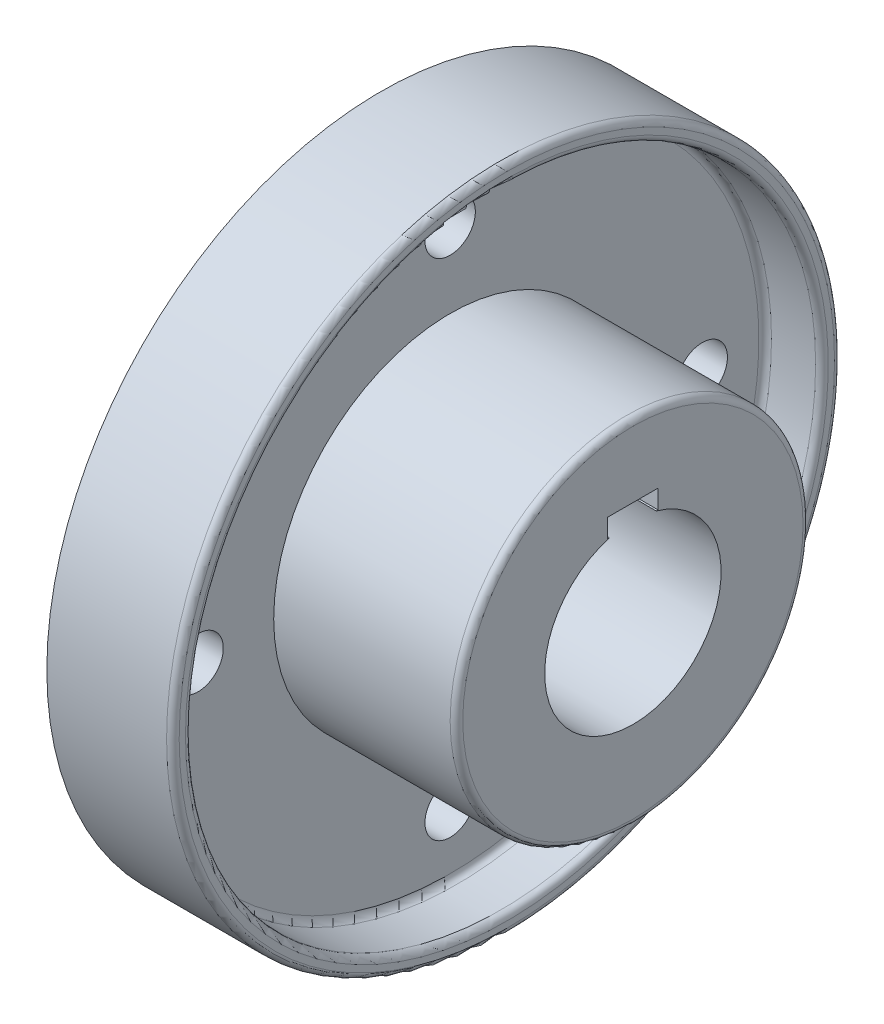
ISO-10303-21;
HEADER;
FILE_DESCRIPTION(('STEP AP214'),'2;1');
FILE_NAME('part.step','',(''),(''),'','','');
FILE_SCHEMA(('AUTOMOTIVE_DESIGN { 1 0 10303 214 1 1 1 1 }'));
ENDSEC;
DATA;
#1=APPLICATION_CONTEXT('core data for automotive mechanical design processes');
#2=APPLICATION_PROTOCOL_DEFINITION('international standard','automotive_design',2000,#1);
#3=PRODUCT_CONTEXT('',#1,'mechanical');
#4=PRODUCT('Part','Part','',(#3));
#5=PRODUCT_RELATED_PRODUCT_CATEGORY('part','',(#4));
#6=PRODUCT_DEFINITION_FORMATION('','',#4);
#7=PRODUCT_DEFINITION_CONTEXT('part definition',#1,'design');
#8=PRODUCT_DEFINITION('design','',#6,#7);
#9=PRODUCT_DEFINITION_SHAPE('','',#8);
#10=(LENGTH_UNIT() NAMED_UNIT(*) SI_UNIT(.MILLI.,.METRE.));
#11=(NAMED_UNIT(*) PLANE_ANGLE_UNIT() SI_UNIT($,.RADIAN.));
#12=(NAMED_UNIT(*) SI_UNIT($,.STERADIAN.) SOLID_ANGLE_UNIT());
#13=UNCERTAINTY_MEASURE_WITH_UNIT(LENGTH_MEASURE(1.E-05),#10,'distance_accuracy_value','');
#14=(GEOMETRIC_REPRESENTATION_CONTEXT(3) GLOBAL_UNCERTAINTY_ASSIGNED_CONTEXT((#13)) GLOBAL_UNIT_ASSIGNED_CONTEXT((#10,
#11,#12)) REPRESENTATION_CONTEXT('',''));
#15=CARTESIAN_POINT('',(0.,0.,0.));
#16=DIRECTION('',(0.,0.,1.));
#17=DIRECTION('',(1.,0.,0.));
#18=AXIS2_PLACEMENT_3D('',#15,#16,#17);
#19=CARTESIAN_POINT('',(0.,106.,0.));
#20=DIRECTION('',(1.,0.,0.));
#21=DIRECTION('',(0.,0.,-1.));
#22=AXIS2_PLACEMENT_3D('',#19,#20,#21);
#23=PLANE('',#22);
#24=CARTESIAN_POINT('',(0.,8.34771439644569E-13,80.));
#25=DIRECTION('',(-1.,0.,0.));
#26=DIRECTION('',(0.,-1.,0.));
#27=AXIS2_PLACEMENT_3D('',#24,#25,#26);
#28=CIRCLE('',#27,8.);
#29=CARTESIAN_POINT('',(0.,-7.99999999999917,80.0000000000001));
#30=VERTEX_POINT('',#29);
#31=EDGE_CURVE('E123',#30,#30,#28,.T.);
#32=ORIENTED_EDGE('',*,*,#31,.F.);
#33=EDGE_LOOP('',(#32));
#34=FACE_BOUND('',#33,.T.);
#35=CARTESIAN_POINT('',(0.,-80.,0.));
#36=DIRECTION('',(-1.,0.,0.));
#37=DIRECTION('',(0.,0.,-1.));
#38=AXIS2_PLACEMENT_3D('',#35,#36,#37);
#39=CIRCLE('',#38,8.);
#40=CARTESIAN_POINT('',(0.,-80.,-8.00000000000001));
#41=VERTEX_POINT('',#40);
#42=EDGE_CURVE('E130',#41,#41,#39,.T.);
#43=ORIENTED_EDGE('',*,*,#42,.F.);
#44=EDGE_LOOP('',(#43));
#45=FACE_BOUND('',#44,.T.);
#46=CARTESIAN_POINT('',(0.,-2.76134425429668E-13,-80.));
#47=DIRECTION('',(-1.,0.,0.));
#48=DIRECTION('',(0.,1.,0.));
#49=AXIS2_PLACEMENT_3D('',#46,#47,#48);
#50=CIRCLE('',#49,8.);
#51=CARTESIAN_POINT('',(0.,7.99999999999973,-80.));
#52=VERTEX_POINT('',#51);
#53=EDGE_CURVE('E134',#52,#52,#50,.T.);
#54=ORIENTED_EDGE('',*,*,#53,.F.);
#55=EDGE_LOOP('',(#54));
#56=FACE_BOUND('',#55,.T.);
#57=CARTESIAN_POINT('',(0.,80.,0.));
#58=DIRECTION('',(-1.,0.,0.));
#59=DIRECTION('',(0.,0.,1.));
#60=AXIS2_PLACEMENT_3D('',#57,#58,#59);
#61=CIRCLE('',#60,8.);
#62=CARTESIAN_POINT('',(0.,80.,8.00000000000001));
#63=VERTEX_POINT('',#62);
#64=EDGE_CURVE('E138',#63,#63,#61,.T.);
#65=ORIENTED_EDGE('',*,*,#64,.F.);
#66=EDGE_LOOP('',(#65));
#67=FACE_BOUND('',#66,.T.);
#68=CARTESIAN_POINT('',(0.,0.,0.));
#69=DIRECTION('',(1.,0.,0.));
#70=DIRECTION('',(0.,0.,-1.));
#71=AXIS2_PLACEMENT_3D('',#68,#69,#70);
#72=CIRCLE('',#71,46.);
#73=CARTESIAN_POINT('',(0.,0.,-46.));
#74=VERTEX_POINT('',#73);
#75=EDGE_CURVE('E181',#74,#74,#72,.F.);
#76=ORIENTED_EDGE('',*,*,#75,.F.);
#77=EDGE_LOOP('',(#76));
#78=FACE_BOUND('',#77,.T.);
#79=CARTESIAN_POINT('',(0.,0.,0.));
#80=DIRECTION('',(-1.,0.,0.));
#81=DIRECTION('',(0.,0.,1.));
#82=AXIS2_PLACEMENT_3D('',#79,#80,#81);
#83=CIRCLE('',#82,106.);
#84=CARTESIAN_POINT('',(0.,0.,106.));
#85=VERTEX_POINT('',#84);
#86=EDGE_CURVE('E151',#85,#85,#83,.T.);
#87=ORIENTED_EDGE('',*,*,#86,.T.);
#88=EDGE_LOOP('',(#87));
#89=FACE_BOUND('',#88,.T.);
#90=ADVANCED_FACE('F32',(#34,#45,#56,#67,#78,#89),#23,.F.);
#91=CARTESIAN_POINT('',(80.,0.,0.));
#92=DIRECTION('',(-1.,0.,0.));
#93=DIRECTION('',(0.,0.,1.));
#94=AXIS2_PLACEMENT_3D('',#91,#92,#93);
#95=PLANE('',#94);
#96=CARTESIAN_POINT('',(80.,0.,0.));
#97=DIRECTION('',(1.,0.,0.));
#98=DIRECTION('',(0.,0.,-1.));
#99=AXIS2_PLACEMENT_3D('',#96,#97,#98);
#100=CIRCLE('',#99,28.);
#101=CARTESIAN_POINT('',(80.,27.,7.41619848709567));
#102=VERTEX_POINT('',#101);
#103=CARTESIAN_POINT('',(80.,27.,-7.41619848709567));
#104=VERTEX_POINT('',#103);
#105=EDGE_CURVE('E146',#102,#104,#100,.T.);
#106=ORIENTED_EDGE('',*,*,#105,.F.);
#107=DIRECTION('',(0.,0.,1.));
#108=VECTOR('',#107,1.);
#109=CARTESIAN_POINT('',(80.,27.,-8.));
#110=LINE('',#109,#108);
#111=CARTESIAN_POINT('',(80.,27.,8.));
#112=VERTEX_POINT('',#111);
#113=EDGE_CURVE('E46',#102,#112,#110,.T.);
#114=ORIENTED_EDGE('',*,*,#113,.T.);
#115=DIRECTION('',(0.,1.,0.));
#116=VECTOR('',#115,1.);
#117=CARTESIAN_POINT('',(80.,27.,8.));
#118=LINE('',#117,#116);
#119=CARTESIAN_POINT('',(80.,33.,8.));
#120=VERTEX_POINT('',#119);
#121=EDGE_CURVE('E88',#112,#120,#118,.T.);
#122=ORIENTED_EDGE('',*,*,#121,.T.);
#123=DIRECTION('',(0.,0.,-1.));
#124=VECTOR('',#123,1.);
#125=CARTESIAN_POINT('',(80.,33.,-8.));
#126=LINE('',#125,#124);
#127=CARTESIAN_POINT('',(80.,33.,-8.));
#128=VERTEX_POINT('',#127);
#129=EDGE_CURVE('E98',#120,#128,#126,.T.);
#130=ORIENTED_EDGE('',*,*,#129,.T.);
#131=DIRECTION('',(0.,-1.,0.));
#132=VECTOR('',#131,1.);
#133=CARTESIAN_POINT('',(80.,27.,-8.));
#134=LINE('',#133,#132);
#135=CARTESIAN_POINT('',(80.,27.,-8.));
#136=VERTEX_POINT('',#135);
#137=EDGE_CURVE('E103',#128,#136,#134,.T.);
#138=ORIENTED_EDGE('',*,*,#137,.T.);
#139=EDGE_CURVE('E95',#136,#104,#110,.T.);
#140=ORIENTED_EDGE('',*,*,#139,.T.);
#141=EDGE_LOOP('',(#106,#114,#122,#130,#138,#140));
#142=FACE_BOUND('',#141,.T.);
#143=CARTESIAN_POINT('',(80.,0.,0.));
#144=DIRECTION('',(-1.,0.,0.));
#145=DIRECTION('',(0.,0.,1.));
#146=AXIS2_PLACEMENT_3D('',#143,#144,#145);
#147=CIRCLE('',#146,54.);
#148=CARTESIAN_POINT('',(80.,0.,54.));
#149=VERTEX_POINT('',#148);
#150=EDGE_CURVE('E178',#149,#149,#147,.T.);
#151=ORIENTED_EDGE('',*,*,#150,.F.);
#152=EDGE_LOOP('',(#151));
#153=FACE_BOUND('',#152,.T.);
#154=ADVANCED_FACE('F106',(#142,#153),#95,.F.);
#155=CARTESIAN_POINT('',(78.,0.,0.));
#156=DIRECTION('',(-1.,0.,0.));
#157=DIRECTION('',(0.,0.,1.));
#158=AXIS2_PLACEMENT_3D('',#155,#156,#157);
#159=TOROIDAL_SURFACE('',#158,54.,2.);
#160=CARTESIAN_POINT('',(78.,0.,0.));
#161=DIRECTION('',(-1.,0.,0.));
#162=DIRECTION('',(0.,0.,1.));
#163=AXIS2_PLACEMENT_3D('',#160,#161,#162);
#164=CIRCLE('',#163,56.);
#165=CARTESIAN_POINT('',(78.,0.,56.));
#166=VERTEX_POINT('',#165);
#167=EDGE_CURVE('E175',#166,#166,#164,.T.);
#168=ORIENTED_EDGE('',*,*,#167,.F.);
#169=EDGE_LOOP('',(#168));
#170=FACE_BOUND('',#169,.T.);
#171=ORIENTED_EDGE('',*,*,#150,.T.);
#172=EDGE_LOOP('',(#171));
#173=FACE_BOUND('',#172,.T.);
#174=ADVANCED_FACE('F218',(#170,#173),#159,.T.);
#175=CARTESIAN_POINT('',(0.,0.,0.));
#176=DIRECTION('',(-1.,0.,0.));
#177=DIRECTION('',(0.,0.,1.));
#178=AXIS2_PLACEMENT_3D('',#175,#176,#177);
#179=CYLINDRICAL_SURFACE('',#178,56.);
#180=CARTESIAN_POINT('',(22.,0.,0.));
#181=DIRECTION('',(-1.,0.,0.));
#182=DIRECTION('',(0.,0.,1.));
#183=AXIS2_PLACEMENT_3D('',#180,#181,#182);
#184=CIRCLE('',#183,56.);
#185=CARTESIAN_POINT('',(22.,0.,56.));
#186=VERTEX_POINT('',#185);
#187=EDGE_CURVE('E172',#186,#186,#184,.T.);
#188=ORIENTED_EDGE('',*,*,#187,.F.);
#189=EDGE_LOOP('',(#188));
#190=FACE_BOUND('',#189,.T.);
#191=ORIENTED_EDGE('',*,*,#167,.T.);
#192=EDGE_LOOP('',(#191));
#193=FACE_BOUND('',#192,.T.);
#194=ADVANCED_FACE('F271',(#190,#193),#179,.T.);
#195=CARTESIAN_POINT('',(22.,98.,0.));
#196=DIRECTION('',(-1.,0.,0.));
#197=DIRECTION('',(0.,0.,1.));
#198=AXIS2_PLACEMENT_3D('',#195,#196,#197);
#199=PLANE('',#198);
#200=CARTESIAN_POINT('',(22.,8.34771439644569E-13,80.));
#201=DIRECTION('',(-1.,0.,0.));
#202=DIRECTION('',(0.,0.,1.));
#203=AXIS2_PLACEMENT_3D('',#200,#201,#202);
#204=CIRCLE('',#203,8.);
#205=CARTESIAN_POINT('',(22.,8.34771439644569E-13,88.));
#206=VERTEX_POINT('',#205);
#207=EDGE_CURVE('E129',#206,#206,#204,.T.);
#208=ORIENTED_EDGE('',*,*,#207,.T.);
#209=EDGE_LOOP('',(#208));
#210=FACE_BOUND('',#209,.T.);
#211=CARTESIAN_POINT('',(22.,-80.,0.));
#212=DIRECTION('',(-1.,0.,0.));
#213=DIRECTION('',(0.,0.,1.));
#214=AXIS2_PLACEMENT_3D('',#211,#212,#213);
#215=CIRCLE('',#214,8.);
#216=CARTESIAN_POINT('',(22.,-80.,8.));
#217=VERTEX_POINT('',#216);
#218=EDGE_CURVE('E133',#217,#217,#215,.T.);
#219=ORIENTED_EDGE('',*,*,#218,.T.);
#220=EDGE_LOOP('',(#219));
#221=FACE_BOUND('',#220,.T.);
#222=CARTESIAN_POINT('',(22.,-2.76134425429668E-13,-80.));
#223=DIRECTION('',(-1.,0.,0.));
#224=DIRECTION('',(0.,0.,1.));
#225=AXIS2_PLACEMENT_3D('',#222,#223,#224);
#226=CIRCLE('',#225,8.);
#227=CARTESIAN_POINT('',(22.,-2.76134425429668E-13,-72.));
#228=VERTEX_POINT('',#227);
#229=EDGE_CURVE('E137',#228,#228,#226,.T.);
#230=ORIENTED_EDGE('',*,*,#229,.T.);
#231=EDGE_LOOP('',(#230));
#232=FACE_BOUND('',#231,.T.);
#233=CARTESIAN_POINT('',(22.,80.,0.));
#234=DIRECTION('',(-1.,0.,0.));
#235=DIRECTION('',(0.,0.,1.));
#236=AXIS2_PLACEMENT_3D('',#233,#234,#235);
#237=CIRCLE('',#236,8.);
#238=CARTESIAN_POINT('',(22.,80.,8.00000000000001));
#239=VERTEX_POINT('',#238);
#240=EDGE_CURVE('E141',#239,#239,#237,.T.);
#241=ORIENTED_EDGE('',*,*,#240,.T.);
#242=EDGE_LOOP('',(#241));
#243=FACE_BOUND('',#242,.T.);
#244=CARTESIAN_POINT('',(22.,0.,0.));
#245=DIRECTION('',(-1.,0.,0.));
#246=DIRECTION('',(0.,0.,1.));
#247=AXIS2_PLACEMENT_3D('',#244,#245,#246);
#248=CIRCLE('',#247,98.);
#249=CARTESIAN_POINT('',(22.,0.,98.));
#250=VERTEX_POINT('',#249);
#251=EDGE_CURVE('E169',#250,#250,#248,.T.);
#252=ORIENTED_EDGE('',*,*,#251,.F.);
#253=EDGE_LOOP('',(#252));
#254=FACE_BOUND('',#253,.T.);
#255=ORIENTED_EDGE('',*,*,#187,.T.);
#256=EDGE_LOOP('',(#255));
#257=FACE_BOUND('',#256,.T.);
#258=ADVANCED_FACE('F265',(#210,#221,#232,#243,#254,#257),#199,.F.);
#259=CARTESIAN_POINT('',(24.,0.,0.));
#260=DIRECTION('',(-1.,0.,0.));
#261=DIRECTION('',(0.,0.,1.));
#262=AXIS2_PLACEMENT_3D('',#259,#260,#261);
#263=TOROIDAL_SURFACE('',#262,98.,2.);
#264=CARTESIAN_POINT('',(24.,0.,0.));
#265=DIRECTION('',(-1.,0.,0.));
#266=DIRECTION('',(0.,0.,1.));
#267=AXIS2_PLACEMENT_3D('',#264,#265,#266);
#268=CIRCLE('',#267,100.);
#269=CARTESIAN_POINT('',(24.,0.,100.));
#270=VERTEX_POINT('',#269);
#271=EDGE_CURVE('E166',#270,#270,#268,.T.);
#272=ORIENTED_EDGE('',*,*,#271,.F.);
#273=EDGE_LOOP('',(#272));
#274=FACE_BOUND('',#273,.T.);
#275=ORIENTED_EDGE('',*,*,#251,.T.);
#276=EDGE_LOOP('',(#275));
#277=FACE_BOUND('',#276,.T.);
#278=ADVANCED_FACE('F259',(#274,#277),#263,.F.);
#279=CARTESIAN_POINT('',(0.,0.,0.));
#280=DIRECTION('',(-1.,0.,0.));
#281=DIRECTION('',(0.,0.,1.));
#282=AXIS2_PLACEMENT_3D('',#279,#280,#281);
#283=CYLINDRICAL_SURFACE('',#282,100.);
#284=CARTESIAN_POINT('',(38.,0.,0.));
#285=DIRECTION('',(-1.,0.,0.));
#286=DIRECTION('',(0.,0.,1.));
#287=AXIS2_PLACEMENT_3D('',#284,#285,#286);
#288=CIRCLE('',#287,100.);
#289=CARTESIAN_POINT('',(38.,0.,100.));
#290=VERTEX_POINT('',#289);
#291=EDGE_CURVE('E163',#290,#290,#288,.T.);
#292=ORIENTED_EDGE('',*,*,#291,.F.);
#293=EDGE_LOOP('',(#292));
#294=FACE_BOUND('',#293,.T.);
#295=ORIENTED_EDGE('',*,*,#271,.T.);
#296=EDGE_LOOP('',(#295));
#297=FACE_BOUND('',#296,.T.);
#298=ADVANCED_FACE('F253',(#294,#297),#283,.F.);
#299=CARTESIAN_POINT('',(38.,0.,0.));
#300=DIRECTION('',(-1.,0.,0.));
#301=DIRECTION('',(0.,0.,1.));
#302=AXIS2_PLACEMENT_3D('',#299,#300,#301);
#303=TOROIDAL_SURFACE('',#302,102.,2.);
#304=CARTESIAN_POINT('',(40.,0.,0.));
#305=DIRECTION('',(-1.,0.,0.));
#306=DIRECTION('',(0.,0.,1.));
#307=AXIS2_PLACEMENT_3D('',#304,#305,#306);
#308=CIRCLE('',#307,102.);
#309=CARTESIAN_POINT('',(40.,0.,102.));
#310=VERTEX_POINT('',#309);
#311=EDGE_CURVE('E160',#310,#310,#308,.T.);
#312=ORIENTED_EDGE('',*,*,#311,.F.);
#313=EDGE_LOOP('',(#312));
#314=FACE_BOUND('',#313,.T.);
#315=ORIENTED_EDGE('',*,*,#291,.T.);
#316=EDGE_LOOP('',(#315));
#317=FACE_BOUND('',#316,.T.);
#318=ADVANCED_FACE('F247',(#314,#317),#303,.T.);
#319=CARTESIAN_POINT('',(40.,104.,0.));
#320=DIRECTION('',(-1.,0.,0.));
#321=DIRECTION('',(0.,0.,1.));
#322=AXIS2_PLACEMENT_3D('',#319,#320,#321);
#323=PLANE('',#322);
#324=CARTESIAN_POINT('',(40.,0.,0.));
#325=DIRECTION('',(-1.,0.,0.));
#326=DIRECTION('',(0.,0.,1.));
#327=AXIS2_PLACEMENT_3D('',#324,#325,#326);
#328=CIRCLE('',#327,104.);
#329=CARTESIAN_POINT('',(40.,0.,104.));
#330=VERTEX_POINT('',#329);
#331=EDGE_CURVE('E157',#330,#330,#328,.T.);
#332=ORIENTED_EDGE('',*,*,#331,.F.);
#333=EDGE_LOOP('',(#332));
#334=FACE_BOUND('',#333,.T.);
#335=ORIENTED_EDGE('',*,*,#311,.T.);
#336=EDGE_LOOP('',(#335));
#337=FACE_BOUND('',#336,.T.);
#338=ADVANCED_FACE('F241',(#334,#337),#323,.F.);
#339=CARTESIAN_POINT('',(38.,0.,0.));
#340=DIRECTION('',(-1.,0.,0.));
#341=DIRECTION('',(0.,0.,1.));
#342=AXIS2_PLACEMENT_3D('',#339,#340,#341);
#343=TOROIDAL_SURFACE('',#342,104.,2.);
#344=CARTESIAN_POINT('',(38.,0.,0.));
#345=DIRECTION('',(-1.,0.,0.));
#346=DIRECTION('',(0.,0.,1.));
#347=AXIS2_PLACEMENT_3D('',#344,#345,#346);
#348=CIRCLE('',#347,106.);
#349=CARTESIAN_POINT('',(38.,0.,106.));
#350=VERTEX_POINT('',#349);
#351=EDGE_CURVE('E154',#350,#350,#348,.T.);
#352=ORIENTED_EDGE('',*,*,#351,.F.);
#353=EDGE_LOOP('',(#352));
#354=FACE_BOUND('',#353,.T.);
#355=ORIENTED_EDGE('',*,*,#331,.T.);
#356=EDGE_LOOP('',(#355));
#357=FACE_BOUND('',#356,.T.);
#358=ADVANCED_FACE('F235',(#354,#357),#343,.T.);
#359=CARTESIAN_POINT('',(0.,0.,0.));
#360=DIRECTION('',(-1.,0.,0.));
#361=DIRECTION('',(0.,0.,1.));
#362=AXIS2_PLACEMENT_3D('',#359,#360,#361);
#363=CYLINDRICAL_SURFACE('',#362,106.);
#364=ORIENTED_EDGE('',*,*,#86,.F.);
#365=EDGE_LOOP('',(#364));
#366=FACE_BOUND('',#365,.T.);
#367=ORIENTED_EDGE('',*,*,#351,.T.);
#368=EDGE_LOOP('',(#367));
#369=FACE_BOUND('',#368,.T.);
#370=ADVANCED_FACE('F231',(#366,#369),#363,.T.);
#371=CARTESIAN_POINT('',(-3.,0.,0.));
#372=DIRECTION('',(1.,0.,0.));
#373=DIRECTION('',(0.,0.,-1.));
#374=AXIS2_PLACEMENT_3D('',#371,#372,#373);
#375=CYLINDRICAL_SURFACE('',#374,46.);
#376=CARTESIAN_POINT('',(-3.,0.,0.));
#377=DIRECTION('',(-1.,0.,0.));
#378=DIRECTION('',(0.,0.,1.));
#379=AXIS2_PLACEMENT_3D('',#376,#377,#378);
#380=CIRCLE('',#379,46.);
#381=CARTESIAN_POINT('',(-3.,0.,46.));
#382=VERTEX_POINT('',#381);
#383=EDGE_CURVE('E145',#382,#382,#380,.T.);
#384=ORIENTED_EDGE('',*,*,#383,.F.);
#385=EDGE_LOOP('',(#384));
#386=FACE_BOUND('',#385,.T.);
#387=ORIENTED_EDGE('',*,*,#75,.T.);
#388=EDGE_LOOP('',(#387));
#389=FACE_BOUND('',#388,.T.);
#390=ADVANCED_FACE('F234',(#386,#389),#375,.T.);
#391=CARTESIAN_POINT('',(-3.,0.,0.));
#392=DIRECTION('',(-1.,0.,0.));
#393=DIRECTION('',(0.,0.,1.));
#394=AXIS2_PLACEMENT_3D('',#391,#392,#393);
#395=PLANE('',#394);
#396=DIRECTION('',(0.,0.,1.));
#397=VECTOR('',#396,1.);
#398=CARTESIAN_POINT('',(-3.,27.,-8.));
#399=LINE('',#398,#397);
#400=CARTESIAN_POINT('',(-3.,27.,7.41619848709567));
#401=VERTEX_POINT('',#400);
#402=CARTESIAN_POINT('',(-3.,27.,8.));
#403=VERTEX_POINT('',#402);
#404=EDGE_CURVE('E110',#401,#403,#399,.T.);
#405=ORIENTED_EDGE('',*,*,#404,.F.);
#406=CARTESIAN_POINT('',(-3.,0.,0.));
#407=DIRECTION('',(1.,0.,0.));
#408=DIRECTION('',(0.,0.,-1.));
#409=AXIS2_PLACEMENT_3D('',#406,#407,#408);
#410=CIRCLE('',#409,28.);
#411=CARTESIAN_POINT('',(-3.,27.,-7.41619848709567));
#412=VERTEX_POINT('',#411);
#413=EDGE_CURVE('E142',#401,#412,#410,.T.);
#414=ORIENTED_EDGE('',*,*,#413,.T.);
#415=CARTESIAN_POINT('',(-3.,27.,-8.));
#416=VERTEX_POINT('',#415);
#417=EDGE_CURVE('E108',#416,#412,#399,.T.);
#418=ORIENTED_EDGE('',*,*,#417,.F.);
#419=DIRECTION('',(0.,-1.,0.));
#420=VECTOR('',#419,1.);
#421=CARTESIAN_POINT('',(-3.,27.,-8.));
#422=LINE('',#421,#420);
#423=CARTESIAN_POINT('',(-3.,33.,-8.));
#424=VERTEX_POINT('',#423);
#425=EDGE_CURVE('E118',#424,#416,#422,.T.);
#426=ORIENTED_EDGE('',*,*,#425,.F.);
#427=DIRECTION('',(0.,0.,-1.));
#428=VECTOR('',#427,1.);
#429=CARTESIAN_POINT('',(-3.,33.,-8.));
#430=LINE('',#429,#428);
#431=CARTESIAN_POINT('',(-3.,33.,8.));
#432=VERTEX_POINT('',#431);
#433=EDGE_CURVE('E116',#432,#424,#430,.T.);
#434=ORIENTED_EDGE('',*,*,#433,.F.);
#435=DIRECTION('',(0.,1.,0.));
#436=VECTOR('',#435,1.);
#437=CARTESIAN_POINT('',(-3.,27.,8.));
#438=LINE('',#437,#436);
#439=EDGE_CURVE('E90',#403,#432,#438,.T.);
#440=ORIENTED_EDGE('',*,*,#439,.F.);
#441=EDGE_LOOP('',(#405,#414,#418,#426,#434,#440));
#442=FACE_BOUND('',#441,.T.);
#443=ORIENTED_EDGE('',*,*,#383,.T.);
#444=EDGE_LOOP('',(#443));
#445=FACE_BOUND('',#444,.T.);
#446=ADVANCED_FACE('F201',(#442,#445),#395,.T.);
#447=CARTESIAN_POINT('',(-3.,0.,0.));
#448=DIRECTION('',(1.,0.,0.));
#449=DIRECTION('',(0.,0.,-1.));
#450=AXIS2_PLACEMENT_3D('',#447,#448,#449);
#451=CYLINDRICAL_SURFACE('',#450,28.);
#452=ORIENTED_EDGE('',*,*,#105,.T.);
#453=DIRECTION('',(1.,0.,0.));
#454=VECTOR('',#453,1.);
#455=CARTESIAN_POINT('',(-3.,27.,-7.41619848709567));
#456=LINE('',#455,#454);
#457=EDGE_CURVE('E11',#104,#412,#456,.F.);
#458=ORIENTED_EDGE('',*,*,#457,.T.);
#459=ORIENTED_EDGE('',*,*,#413,.F.);
#460=DIRECTION('',(1.,0.,0.));
#461=VECTOR('',#460,1.);
#462=CARTESIAN_POINT('',(-3.,27.,7.41619848709567));
#463=LINE('',#462,#461);
#464=EDGE_CURVE('E39',#401,#102,#463,.T.);
#465=ORIENTED_EDGE('',*,*,#464,.T.);
#466=EDGE_LOOP('',(#452,#458,#459,#465));
#467=FACE_BOUND('',#466,.T.);
#468=ADVANCED_FACE('F193',(#467),#451,.F.);
#469=CARTESIAN_POINT('',(80.,80.,0.));
#470=DIRECTION('',(-1.,0.,0.));
#471=DIRECTION('',(0.,0.,1.));
#472=AXIS2_PLACEMENT_3D('',#469,#470,#471);
#473=CYLINDRICAL_SURFACE('',#472,8.);
#474=ORIENTED_EDGE('',*,*,#64,.T.);
#475=EDGE_LOOP('',(#474));
#476=FACE_BOUND('',#475,.T.);
#477=ORIENTED_EDGE('',*,*,#240,.F.);
#478=EDGE_LOOP('',(#477));
#479=FACE_BOUND('',#478,.T.);
#480=ADVANCED_FACE('F295',(#476,#479),#473,.F.);
#481=CARTESIAN_POINT('',(80.,-2.76134425429668E-13,-80.));
#482=DIRECTION('',(-1.,0.,0.));
#483=DIRECTION('',(0.,0.,1.));
#484=AXIS2_PLACEMENT_3D('',#481,#482,#483);
#485=CYLINDRICAL_SURFACE('',#484,8.);
#486=ORIENTED_EDGE('',*,*,#53,.T.);
#487=EDGE_LOOP('',(#486));
#488=FACE_BOUND('',#487,.T.);
#489=ORIENTED_EDGE('',*,*,#229,.F.);
#490=EDGE_LOOP('',(#489));
#491=FACE_BOUND('',#490,.T.);
#492=ADVANCED_FACE('F298',(#488,#491),#485,.F.);
#493=CARTESIAN_POINT('',(80.,-80.,0.));
#494=DIRECTION('',(-1.,0.,0.));
#495=DIRECTION('',(0.,0.,1.));
#496=AXIS2_PLACEMENT_3D('',#493,#494,#495);
#497=CYLINDRICAL_SURFACE('',#496,8.);
#498=ORIENTED_EDGE('',*,*,#42,.T.);
#499=EDGE_LOOP('',(#498));
#500=FACE_BOUND('',#499,.T.);
#501=ORIENTED_EDGE('',*,*,#218,.F.);
#502=EDGE_LOOP('',(#501));
#503=FACE_BOUND('',#502,.T.);
#504=ADVANCED_FACE('F302',(#500,#503),#497,.F.);
#505=CARTESIAN_POINT('',(80.,8.34771439644569E-13,80.));
#506=DIRECTION('',(-1.,0.,0.));
#507=DIRECTION('',(0.,0.,1.));
#508=AXIS2_PLACEMENT_3D('',#505,#506,#507);
#509=CYLINDRICAL_SURFACE('',#508,8.);
#510=ORIENTED_EDGE('',*,*,#31,.T.);
#511=EDGE_LOOP('',(#510));
#512=FACE_BOUND('',#511,.T.);
#513=ORIENTED_EDGE('',*,*,#207,.F.);
#514=EDGE_LOOP('',(#513));
#515=FACE_BOUND('',#514,.T.);
#516=ADVANCED_FACE('F211',(#512,#515),#509,.F.);
#517=CARTESIAN_POINT('',(80.,27.,-8.));
#518=DIRECTION('',(0.,-1.,0.));
#519=DIRECTION('',(0.,0.,-1.));
#520=AXIS2_PLACEMENT_3D('',#517,#518,#519);
#521=PLANE('',#520);
#522=ORIENTED_EDGE('',*,*,#139,.F.);
#523=DIRECTION('',(-1.,0.,0.));
#524=VECTOR('',#523,1.);
#525=CARTESIAN_POINT('',(80.,27.,-8.));
#526=LINE('',#525,#524);
#527=EDGE_CURVE('E124',#136,#416,#526,.T.);
#528=ORIENTED_EDGE('',*,*,#527,.T.);
#529=ORIENTED_EDGE('',*,*,#417,.T.);
#530=ORIENTED_EDGE('',*,*,#457,.F.);
#531=EDGE_LOOP('',(#522,#528,#529,#530));
#532=FACE_BOUND('',#531,.T.);
#533=ADVANCED_FACE('F195',(#532),#521,.F.);
#534=ORIENTED_EDGE('',*,*,#404,.T.);
#535=DIRECTION('',(-1.,0.,0.));
#536=VECTOR('',#535,1.);
#537=CARTESIAN_POINT('',(80.,27.,8.));
#538=LINE('',#537,#536);
#539=EDGE_CURVE('E121',#112,#403,#538,.T.);
#540=ORIENTED_EDGE('',*,*,#539,.F.);
#541=ORIENTED_EDGE('',*,*,#113,.F.);
#542=ORIENTED_EDGE('',*,*,#464,.F.);
#543=EDGE_LOOP('',(#534,#540,#541,#542));
#544=FACE_BOUND('',#543,.T.);
#545=ADVANCED_FACE('F203',(#544),#521,.F.);
#546=CARTESIAN_POINT('',(80.,27.,8.));
#547=DIRECTION('',(0.,0.,1.));
#548=DIRECTION('',(1.,0.,0.));
#549=AXIS2_PLACEMENT_3D('',#546,#547,#548);
#550=PLANE('',#549);
#551=ORIENTED_EDGE('',*,*,#439,.T.);
#552=DIRECTION('',(-1.,0.,0.));
#553=VECTOR('',#552,1.);
#554=CARTESIAN_POINT('',(80.,33.,8.));
#555=LINE('',#554,#553);
#556=EDGE_CURVE('E83',#120,#432,#555,.T.);
#557=ORIENTED_EDGE('',*,*,#556,.F.);
#558=ORIENTED_EDGE('',*,*,#121,.F.);
#559=ORIENTED_EDGE('',*,*,#539,.T.);
#560=EDGE_LOOP('',(#551,#557,#558,#559));
#561=FACE_BOUND('',#560,.T.);
#562=ADVANCED_FACE('F85',(#561),#550,.F.);
#563=CARTESIAN_POINT('',(80.,27.,-8.));
#564=DIRECTION('',(0.,0.,-1.));
#565=DIRECTION('',(-1.,0.,0.));
#566=AXIS2_PLACEMENT_3D('',#563,#564,#565);
#567=PLANE('',#566);
#568=ORIENTED_EDGE('',*,*,#425,.T.);
#569=ORIENTED_EDGE('',*,*,#527,.F.);
#570=ORIENTED_EDGE('',*,*,#137,.F.);
#571=DIRECTION('',(-1.,0.,0.));
#572=VECTOR('',#571,1.);
#573=CARTESIAN_POINT('',(80.,33.,-8.));
#574=LINE('',#573,#572);
#575=EDGE_CURVE('E94',#128,#424,#574,.T.);
#576=ORIENTED_EDGE('',*,*,#575,.T.);
#577=EDGE_LOOP('',(#568,#569,#570,#576));
#578=FACE_BOUND('',#577,.T.);
#579=ADVANCED_FACE('F199',(#578),#567,.F.);
#580=CARTESIAN_POINT('',(80.,33.,-8.));
#581=DIRECTION('',(0.,1.,0.));
#582=DIRECTION('',(0.,0.,1.));
#583=AXIS2_PLACEMENT_3D('',#580,#581,#582);
#584=PLANE('',#583);
#585=ORIENTED_EDGE('',*,*,#433,.T.);
#586=ORIENTED_EDGE('',*,*,#575,.F.);
#587=ORIENTED_EDGE('',*,*,#129,.F.);
#588=ORIENTED_EDGE('',*,*,#556,.T.);
#589=EDGE_LOOP('',(#585,#586,#587,#588));
#590=FACE_BOUND('',#589,.T.);
#591=ADVANCED_FACE('F99',(#590),#584,.F.);
#592=CLOSED_SHELL('',(#90,#154,#174,#194,#258,#278,#298,#318,#338,#358,#370,#390,#446,#468,#480,
#492,#504,#516,#533,#545,#562,#579,#591));
#593=MANIFOLD_SOLID_BREP('B2',#592);
#594=ADVANCED_BREP_SHAPE_REPRESENTATION('',(#18,#593),#14);
#595=SHAPE_DEFINITION_REPRESENTATION(#9,#594);
ENDSEC;
END-ISO-10303-21;
